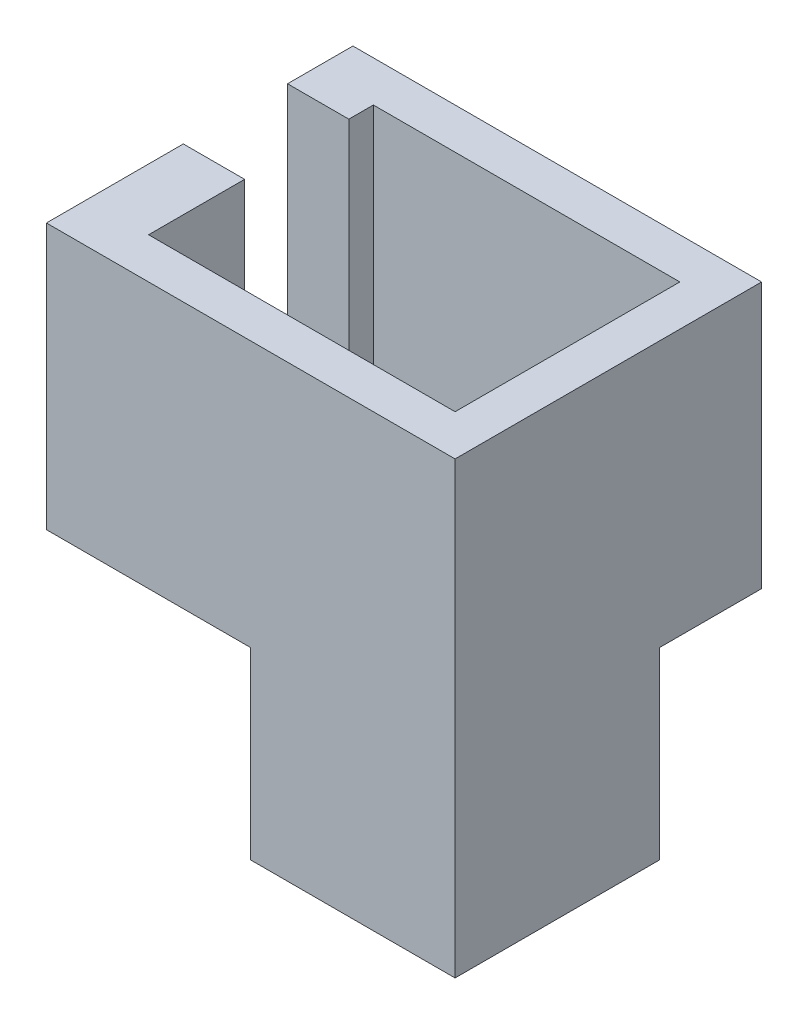
ISO-10303-21;
HEADER;
FILE_DESCRIPTION(('STEP AP214'),'2;1');
FILE_NAME('part.step','',(''),(''),'','','');
FILE_SCHEMA(('AUTOMOTIVE_DESIGN { 1 0 10303 214 1 1 1 1 }'));
ENDSEC;
DATA;
#1=APPLICATION_CONTEXT('core data for automotive mechanical design processes');
#2=APPLICATION_PROTOCOL_DEFINITION('international standard','automotive_design',2000,#1);
#3=PRODUCT_CONTEXT('',#1,'mechanical');
#4=PRODUCT('Part','Part','',(#3));
#5=PRODUCT_RELATED_PRODUCT_CATEGORY('part','',(#4));
#6=PRODUCT_DEFINITION_FORMATION('','',#4);
#7=PRODUCT_DEFINITION_CONTEXT('part definition',#1,'design');
#8=PRODUCT_DEFINITION('design','',#6,#7);
#9=PRODUCT_DEFINITION_SHAPE('','',#8);
#10=(LENGTH_UNIT() NAMED_UNIT(*) SI_UNIT(.MILLI.,.METRE.));
#11=(NAMED_UNIT(*) PLANE_ANGLE_UNIT() SI_UNIT($,.RADIAN.));
#12=(NAMED_UNIT(*) SI_UNIT($,.STERADIAN.) SOLID_ANGLE_UNIT());
#13=UNCERTAINTY_MEASURE_WITH_UNIT(LENGTH_MEASURE(1.E-05),#10,'distance_accuracy_value','');
#14=(GEOMETRIC_REPRESENTATION_CONTEXT(3) GLOBAL_UNCERTAINTY_ASSIGNED_CONTEXT((#13)) GLOBAL_UNIT_ASSIGNED_CONTEXT((#10,
#11,#12)) REPRESENTATION_CONTEXT('',''));
#15=CARTESIAN_POINT('',(0.,0.,0.));
#16=DIRECTION('',(0.,0.,1.));
#17=DIRECTION('',(1.,0.,0.));
#18=AXIS2_PLACEMENT_3D('',#15,#16,#17);
#19=CARTESIAN_POINT('',(0.,-1.,0.));
#20=DIRECTION('',(0.,1.,0.));
#21=DIRECTION('',(0.,0.,1.));
#22=AXIS2_PLACEMENT_3D('',#19,#20,#21);
#23=PLANE('',#22);
#24=DIRECTION('',(1.,0.,0.));
#25=VECTOR('',#24,1.);
#26=CARTESIAN_POINT('',(20.,-1.,-10.));
#27=LINE('',#26,#25);
#28=CARTESIAN_POINT('',(10.,-1.,-10.));
#29=VERTEX_POINT('',#28);
#30=CARTESIAN_POINT('',(20.,-1.,-10.));
#31=VERTEX_POINT('',#30);
#32=EDGE_CURVE('E165',#29,#31,#27,.T.);
#33=ORIENTED_EDGE('',*,*,#32,.F.);
#34=DIRECTION('',(0.,0.,-1.));
#35=VECTOR('',#34,1.);
#36=CARTESIAN_POINT('',(10.,-1.,0.));
#37=LINE('',#36,#35);
#38=CARTESIAN_POINT('',(10.,-1.,0.));
#39=VERTEX_POINT('',#38);
#40=EDGE_CURVE('E48',#39,#29,#37,.T.);
#41=ORIENTED_EDGE('',*,*,#40,.F.);
#42=DIRECTION('',(-1.,0.,0.));
#43=VECTOR('',#42,1.);
#44=CARTESIAN_POINT('',(20.,-1.,0.));
#45=LINE('',#44,#43);
#46=CARTESIAN_POINT('',(0.,-1.,0.));
#47=VERTEX_POINT('',#46);
#48=EDGE_CURVE('E182',#39,#47,#45,.T.);
#49=ORIENTED_EDGE('',*,*,#48,.T.);
#50=DIRECTION('',(0.,0.,-1.));
#51=VECTOR('',#50,1.);
#52=CARTESIAN_POINT('',(0.,-1.,0.));
#53=LINE('',#52,#51);
#54=CARTESIAN_POINT('',(0.,-1.,-15.));
#55=VERTEX_POINT('',#54);
#56=EDGE_CURVE('E184',#47,#55,#53,.T.);
#57=ORIENTED_EDGE('',*,*,#56,.T.);
#58=DIRECTION('',(1.,0.,0.));
#59=VECTOR('',#58,1.);
#60=CARTESIAN_POINT('',(20.,-1.,-15.));
#61=LINE('',#60,#59);
#62=CARTESIAN_POINT('',(20.,-1.,-15.));
#63=VERTEX_POINT('',#62);
#64=EDGE_CURVE('E187',#55,#63,#61,.T.);
#65=ORIENTED_EDGE('',*,*,#64,.T.);
#66=DIRECTION('',(0.,0.,1.));
#67=VECTOR('',#66,1.);
#68=CARTESIAN_POINT('',(20.,-1.,0.));
#69=LINE('',#68,#67);
#70=EDGE_CURVE('E54',#63,#31,#69,.T.);
#71=ORIENTED_EDGE('',*,*,#70,.T.);
#72=EDGE_LOOP('',(#33,#41,#49,#57,#65,#71));
#73=FACE_BOUND('',#72,.T.);
#74=ADVANCED_FACE('F33',(#73),#23,.F.);
#75=CARTESIAN_POINT('',(0.,12.,0.));
#76=DIRECTION('',(0.,0.,-1.));
#77=DIRECTION('',(-1.,0.,0.));
#78=AXIS2_PLACEMENT_3D('',#75,#76,#77);
#79=PLANE('',#78);
#80=DIRECTION('',(0.,-1.,0.));
#81=VECTOR('',#80,1.);
#82=CARTESIAN_POINT('',(0.,12.,0.));
#83=LINE('',#82,#81);
#84=CARTESIAN_POINT('',(0.,12.,0.));
#85=VERTEX_POINT('',#84);
#86=EDGE_CURVE('E41',#85,#47,#83,.T.);
#87=ORIENTED_EDGE('',*,*,#86,.T.);
#88=ORIENTED_EDGE('',*,*,#48,.F.);
#89=DIRECTION('',(0.,1.,0.));
#90=VECTOR('',#89,1.);
#91=CARTESIAN_POINT('',(10.,-10.,0.));
#92=LINE('',#91,#90);
#93=CARTESIAN_POINT('',(10.,-10.,0.));
#94=VERTEX_POINT('',#93);
#95=EDGE_CURVE('E156',#94,#39,#92,.T.);
#96=ORIENTED_EDGE('',*,*,#95,.F.);
#97=DIRECTION('',(-1.,0.,0.));
#98=VECTOR('',#97,1.);
#99=CARTESIAN_POINT('',(20.,-10.,0.));
#100=LINE('',#99,#98);
#101=CARTESIAN_POINT('',(20.,-10.,0.));
#102=VERTEX_POINT('',#101);
#103=EDGE_CURVE('E153',#102,#94,#100,.T.);
#104=ORIENTED_EDGE('',*,*,#103,.F.);
#105=DIRECTION('',(0.,-1.,0.));
#106=VECTOR('',#105,1.);
#107=CARTESIAN_POINT('',(20.,12.,0.));
#108=LINE('',#107,#106);
#109=CARTESIAN_POINT('',(20.,12.,0.));
#110=VERTEX_POINT('',#109);
#111=EDGE_CURVE('E141',#110,#102,#108,.T.);
#112=ORIENTED_EDGE('',*,*,#111,.F.);
#113=DIRECTION('',(1.,0.,0.));
#114=VECTOR('',#113,1.);
#115=CARTESIAN_POINT('',(0.,12.,0.));
#116=LINE('',#115,#114);
#117=EDGE_CURVE('E195',#85,#110,#116,.T.);
#118=ORIENTED_EDGE('',*,*,#117,.F.);
#119=EDGE_LOOP('',(#87,#88,#96,#104,#112,#118));
#120=FACE_BOUND('',#119,.T.);
#121=ADVANCED_FACE('F35',(#120),#79,.F.);
#122=CARTESIAN_POINT('',(20.,12.,0.));
#123=DIRECTION('',(-1.,0.,0.));
#124=DIRECTION('',(0.,0.,1.));
#125=AXIS2_PLACEMENT_3D('',#122,#123,#124);
#126=PLANE('',#125);
#127=ORIENTED_EDGE('',*,*,#111,.T.);
#128=DIRECTION('',(0.,0.,1.));
#129=VECTOR('',#128,1.);
#130=CARTESIAN_POINT('',(20.,-10.,0.));
#131=LINE('',#130,#129);
#132=CARTESIAN_POINT('',(20.,-10.,-10.));
#133=VERTEX_POINT('',#132);
#134=EDGE_CURVE('E146',#133,#102,#131,.T.);
#135=ORIENTED_EDGE('',*,*,#134,.F.);
#136=DIRECTION('',(0.,1.,0.));
#137=VECTOR('',#136,1.);
#138=CARTESIAN_POINT('',(20.,-10.,-10.));
#139=LINE('',#138,#137);
#140=EDGE_CURVE('E173',#133,#31,#139,.T.);
#141=ORIENTED_EDGE('',*,*,#140,.T.);
#142=ORIENTED_EDGE('',*,*,#70,.F.);
#143=DIRECTION('',(0.,-1.,0.));
#144=VECTOR('',#143,1.);
#145=CARTESIAN_POINT('',(20.,12.,-15.));
#146=LINE('',#145,#144);
#147=CARTESIAN_POINT('',(20.,12.,-15.));
#148=VERTEX_POINT('',#147);
#149=EDGE_CURVE('E150',#148,#63,#146,.T.);
#150=ORIENTED_EDGE('',*,*,#149,.F.);
#151=DIRECTION('',(0.,0.,-1.));
#152=VECTOR('',#151,1.);
#153=CARTESIAN_POINT('',(20.,12.,0.));
#154=LINE('',#153,#152);
#155=EDGE_CURVE('E148',#110,#148,#154,.T.);
#156=ORIENTED_EDGE('',*,*,#155,.F.);
#157=EDGE_LOOP('',(#127,#135,#141,#142,#150,#156));
#158=FACE_BOUND('',#157,.T.);
#159=ADVANCED_FACE('F143',(#158),#126,.F.);
#160=CARTESIAN_POINT('',(0.,12.,-15.));
#161=DIRECTION('',(0.,0.,1.));
#162=DIRECTION('',(1.,0.,0.));
#163=AXIS2_PLACEMENT_3D('',#160,#161,#162);
#164=PLANE('',#163);
#165=ORIENTED_EDGE('',*,*,#149,.T.);
#166=ORIENTED_EDGE('',*,*,#64,.F.);
#167=DIRECTION('',(0.,-1.,0.));
#168=VECTOR('',#167,1.);
#169=CARTESIAN_POINT('',(0.,12.,-15.));
#170=LINE('',#169,#168);
#171=CARTESIAN_POINT('',(0.,12.,-15.));
#172=VERTEX_POINT('',#171);
#173=EDGE_CURVE('E260',#172,#55,#170,.T.);
#174=ORIENTED_EDGE('',*,*,#173,.F.);
#175=DIRECTION('',(-1.,0.,0.));
#176=VECTOR('',#175,1.);
#177=CARTESIAN_POINT('',(0.,12.,-15.));
#178=LINE('',#177,#176);
#179=EDGE_CURVE('E199',#148,#172,#178,.T.);
#180=ORIENTED_EDGE('',*,*,#179,.F.);
#181=EDGE_LOOP('',(#165,#166,#174,#180));
#182=FACE_BOUND('',#181,.T.);
#183=ADVANCED_FACE('F271',(#182),#164,.F.);
#184=CARTESIAN_POINT('',(0.,12.,-15.));
#185=DIRECTION('',(1.,0.,0.));
#186=DIRECTION('',(0.,0.,-1.));
#187=AXIS2_PLACEMENT_3D('',#184,#185,#186);
#188=PLANE('',#187);
#189=ORIENTED_EDGE('',*,*,#173,.T.);
#190=ORIENTED_EDGE('',*,*,#56,.F.);
#191=ORIENTED_EDGE('',*,*,#86,.F.);
#192=DIRECTION('',(0.,0.,1.));
#193=VECTOR('',#192,1.);
#194=CARTESIAN_POINT('',(0.,12.,0.));
#195=LINE('',#194,#193);
#196=CARTESIAN_POINT('',(0.,12.,-6.7));
#197=VERTEX_POINT('',#196);
#198=EDGE_CURVE('E192',#197,#85,#195,.T.);
#199=ORIENTED_EDGE('',*,*,#198,.F.);
#200=DIRECTION('',(0.,-1.,0.));
#201=VECTOR('',#200,1.);
#202=CARTESIAN_POINT('',(0.,12.,-6.7));
#203=LINE('',#202,#201);
#204=CARTESIAN_POINT('',(0.,0.,-6.7));
#205=VERTEX_POINT('',#204);
#206=EDGE_CURVE('E217',#197,#205,#203,.T.);
#207=ORIENTED_EDGE('',*,*,#206,.T.);
#208=DIRECTION('',(0.,0.,-1.));
#209=VECTOR('',#208,1.);
#210=CARTESIAN_POINT('',(0.,0.,0.));
#211=LINE('',#210,#209);
#212=CARTESIAN_POINT('',(0.,0.,-11.8));
#213=VERTEX_POINT('',#212);
#214=EDGE_CURVE('E180',#205,#213,#211,.T.);
#215=ORIENTED_EDGE('',*,*,#214,.T.);
#216=DIRECTION('',(0.,-1.,0.));
#217=VECTOR('',#216,1.);
#218=CARTESIAN_POINT('',(0.,12.,-11.8));
#219=LINE('',#218,#217);
#220=CARTESIAN_POINT('',(0.,12.,-11.8));
#221=VERTEX_POINT('',#220);
#222=EDGE_CURVE('E257',#221,#213,#219,.T.);
#223=ORIENTED_EDGE('',*,*,#222,.F.);
#224=DIRECTION('',(0.,0.,1.));
#225=VECTOR('',#224,1.);
#226=CARTESIAN_POINT('',(0.,12.,-15.));
#227=LINE('',#226,#225);
#228=EDGE_CURVE('E201',#172,#221,#227,.T.);
#229=ORIENTED_EDGE('',*,*,#228,.F.);
#230=EDGE_LOOP('',(#189,#190,#191,#199,#207,#215,#223,#229));
#231=FACE_BOUND('',#230,.T.);
#232=ADVANCED_FACE('F266',(#231),#188,.F.);
#233=CARTESIAN_POINT('',(0.,12.,-11.8));
#234=DIRECTION('',(0.,0.,-1.));
#235=DIRECTION('',(-1.,0.,0.));
#236=AXIS2_PLACEMENT_3D('',#233,#234,#235);
#237=PLANE('',#236);
#238=DIRECTION('',(1.,0.,0.));
#239=VECTOR('',#238,1.);
#240=CARTESIAN_POINT('',(0.,0.,-11.8));
#241=LINE('',#240,#239);
#242=CARTESIAN_POINT('',(3.,0.,-11.8));
#243=VERTEX_POINT('',#242);
#244=EDGE_CURVE('E189',#213,#243,#241,.T.);
#245=ORIENTED_EDGE('',*,*,#244,.T.);
#246=DIRECTION('',(0.,-1.,0.));
#247=VECTOR('',#246,1.);
#248=CARTESIAN_POINT('',(3.,12.,-11.8));
#249=LINE('',#248,#247);
#250=CARTESIAN_POINT('',(3.,12.,-11.8));
#251=VERTEX_POINT('',#250);
#252=EDGE_CURVE('E254',#251,#243,#249,.T.);
#253=ORIENTED_EDGE('',*,*,#252,.F.);
#254=DIRECTION('',(1.,0.,0.));
#255=VECTOR('',#254,1.);
#256=CARTESIAN_POINT('',(0.,12.,-11.8));
#257=LINE('',#256,#255);
#258=EDGE_CURVE('E203',#221,#251,#257,.T.);
#259=ORIENTED_EDGE('',*,*,#258,.F.);
#260=ORIENTED_EDGE('',*,*,#222,.T.);
#261=EDGE_LOOP('',(#245,#253,#259,#260));
#262=FACE_BOUND('',#261,.T.);
#263=ADVANCED_FACE('F324',(#262),#237,.F.);
#264=CARTESIAN_POINT('',(3.,12.,-11.8));
#265=DIRECTION('',(-1.,0.,0.));
#266=DIRECTION('',(0.,0.,1.));
#267=AXIS2_PLACEMENT_3D('',#264,#265,#266);
#268=PLANE('',#267);
#269=DIRECTION('',(0.,0.,-1.));
#270=VECTOR('',#269,1.);
#271=CARTESIAN_POINT('',(3.,0.,-11.8));
#272=LINE('',#271,#270);
#273=CARTESIAN_POINT('',(3.,0.,-13.));
#274=VERTEX_POINT('',#273);
#275=EDGE_CURVE('E220',#243,#274,#272,.T.);
#276=ORIENTED_EDGE('',*,*,#275,.T.);
#277=DIRECTION('',(0.,-1.,0.));
#278=VECTOR('',#277,1.);
#279=CARTESIAN_POINT('',(3.,12.,-13.));
#280=LINE('',#279,#278);
#281=CARTESIAN_POINT('',(3.,12.,-13.));
#282=VERTEX_POINT('',#281);
#283=EDGE_CURVE('E251',#282,#274,#280,.T.);
#284=ORIENTED_EDGE('',*,*,#283,.F.);
#285=DIRECTION('',(0.,0.,-1.));
#286=VECTOR('',#285,1.);
#287=CARTESIAN_POINT('',(3.,12.,-11.8));
#288=LINE('',#287,#286);
#289=EDGE_CURVE('E205',#251,#282,#288,.T.);
#290=ORIENTED_EDGE('',*,*,#289,.F.);
#291=ORIENTED_EDGE('',*,*,#252,.T.);
#292=EDGE_LOOP('',(#276,#284,#290,#291));
#293=FACE_BOUND('',#292,.T.);
#294=ADVANCED_FACE('F320',(#293),#268,.F.);
#295=CARTESIAN_POINT('',(18.,12.,-13.));
#296=DIRECTION('',(0.,0.,-1.));
#297=DIRECTION('',(-1.,0.,0.));
#298=AXIS2_PLACEMENT_3D('',#295,#296,#297);
#299=PLANE('',#298);
#300=DIRECTION('',(1.,0.,0.));
#301=VECTOR('',#300,1.);
#302=CARTESIAN_POINT('',(18.,0.,-13.));
#303=LINE('',#302,#301);
#304=CARTESIAN_POINT('',(18.,0.,-13.));
#305=VERTEX_POINT('',#304);
#306=EDGE_CURVE('E223',#274,#305,#303,.T.);
#307=ORIENTED_EDGE('',*,*,#306,.T.);
#308=DIRECTION('',(0.,-1.,0.));
#309=VECTOR('',#308,1.);
#310=CARTESIAN_POINT('',(18.,12.,-13.));
#311=LINE('',#310,#309);
#312=CARTESIAN_POINT('',(18.,12.,-13.));
#313=VERTEX_POINT('',#312);
#314=EDGE_CURVE('E248',#313,#305,#311,.T.);
#315=ORIENTED_EDGE('',*,*,#314,.F.);
#316=DIRECTION('',(1.,0.,0.));
#317=VECTOR('',#316,1.);
#318=CARTESIAN_POINT('',(18.,12.,-13.));
#319=LINE('',#318,#317);
#320=EDGE_CURVE('E207',#282,#313,#319,.T.);
#321=ORIENTED_EDGE('',*,*,#320,.F.);
#322=ORIENTED_EDGE('',*,*,#283,.T.);
#323=EDGE_LOOP('',(#307,#315,#321,#322));
#324=FACE_BOUND('',#323,.T.);
#325=ADVANCED_FACE('F316',(#324),#299,.F.);
#326=CARTESIAN_POINT('',(18.,12.,-2.));
#327=DIRECTION('',(1.,0.,0.));
#328=DIRECTION('',(0.,0.,-1.));
#329=AXIS2_PLACEMENT_3D('',#326,#327,#328);
#330=PLANE('',#329);
#331=CARTESIAN_POINT('',(18.,2.51,-10.49));
#332=DIRECTION('',(1.,0.,0.));
#333=DIRECTION('',(0.,0.,-1.));
#334=AXIS2_PLACEMENT_3D('',#331,#332,#333);
#335=CIRCLE('',#334,2.5);
#336=CARTESIAN_POINT('',(18.,2.51,-12.99));
#337=VERTEX_POINT('',#336);
#338=EDGE_CURVE('E11',#337,#337,#335,.F.);
#339=ORIENTED_EDGE('',*,*,#338,.F.);
#340=EDGE_LOOP('',(#339));
#341=FACE_BOUND('',#340,.T.);
#342=DIRECTION('',(0.,0.,1.));
#343=VECTOR('',#342,1.);
#344=CARTESIAN_POINT('',(18.,0.,-2.));
#345=LINE('',#344,#343);
#346=CARTESIAN_POINT('',(18.,0.,-2.));
#347=VERTEX_POINT('',#346);
#348=EDGE_CURVE('E226',#305,#347,#345,.T.);
#349=ORIENTED_EDGE('',*,*,#348,.T.);
#350=DIRECTION('',(0.,-1.,0.));
#351=VECTOR('',#350,1.);
#352=CARTESIAN_POINT('',(18.,12.,-2.));
#353=LINE('',#352,#351);
#354=CARTESIAN_POINT('',(18.,12.,-2.));
#355=VERTEX_POINT('',#354);
#356=EDGE_CURVE('E245',#355,#347,#353,.T.);
#357=ORIENTED_EDGE('',*,*,#356,.F.);
#358=DIRECTION('',(0.,0.,1.));
#359=VECTOR('',#358,1.);
#360=CARTESIAN_POINT('',(18.,12.,-2.));
#361=LINE('',#360,#359);
#362=EDGE_CURVE('E209',#313,#355,#361,.T.);
#363=ORIENTED_EDGE('',*,*,#362,.F.);
#364=ORIENTED_EDGE('',*,*,#314,.T.);
#365=EDGE_LOOP('',(#349,#357,#363,#364));
#366=FACE_BOUND('',#365,.T.);
#367=ADVANCED_FACE('F312',(#341,#366),#330,.F.);
#368=CARTESIAN_POINT('',(3.,12.,-2.));
#369=DIRECTION('',(0.,0.,1.));
#370=DIRECTION('',(1.,0.,0.));
#371=AXIS2_PLACEMENT_3D('',#368,#369,#370);
#372=PLANE('',#371);
#373=DIRECTION('',(-1.,0.,0.));
#374=VECTOR('',#373,1.);
#375=CARTESIAN_POINT('',(3.,0.,-2.));
#376=LINE('',#375,#374);
#377=CARTESIAN_POINT('',(3.,0.,-2.));
#378=VERTEX_POINT('',#377);
#379=EDGE_CURVE('E229',#347,#378,#376,.T.);
#380=ORIENTED_EDGE('',*,*,#379,.T.);
#381=DIRECTION('',(0.,-1.,0.));
#382=VECTOR('',#381,1.);
#383=CARTESIAN_POINT('',(3.,12.,-2.));
#384=LINE('',#383,#382);
#385=CARTESIAN_POINT('',(3.,12.,-2.));
#386=VERTEX_POINT('',#385);
#387=EDGE_CURVE('E242',#386,#378,#384,.T.);
#388=ORIENTED_EDGE('',*,*,#387,.F.);
#389=DIRECTION('',(-1.,0.,0.));
#390=VECTOR('',#389,1.);
#391=CARTESIAN_POINT('',(3.,12.,-2.));
#392=LINE('',#391,#390);
#393=EDGE_CURVE('E211',#355,#386,#392,.T.);
#394=ORIENTED_EDGE('',*,*,#393,.F.);
#395=ORIENTED_EDGE('',*,*,#356,.T.);
#396=EDGE_LOOP('',(#380,#388,#394,#395));
#397=FACE_BOUND('',#396,.T.);
#398=ADVANCED_FACE('F308',(#397),#372,.F.);
#399=CARTESIAN_POINT('',(3.,12.,-2.));
#400=DIRECTION('',(-1.,0.,0.));
#401=DIRECTION('',(0.,0.,1.));
#402=AXIS2_PLACEMENT_3D('',#399,#400,#401);
#403=PLANE('',#402);
#404=DIRECTION('',(0.,0.,-1.));
#405=VECTOR('',#404,1.);
#406=CARTESIAN_POINT('',(3.,0.,-2.));
#407=LINE('',#406,#405);
#408=CARTESIAN_POINT('',(3.,0.,-6.7));
#409=VERTEX_POINT('',#408);
#410=EDGE_CURVE('E232',#378,#409,#407,.T.);
#411=ORIENTED_EDGE('',*,*,#410,.T.);
#412=DIRECTION('',(0.,-1.,0.));
#413=VECTOR('',#412,1.);
#414=CARTESIAN_POINT('',(3.,12.,-6.7));
#415=LINE('',#414,#413);
#416=CARTESIAN_POINT('',(3.,12.,-6.7));
#417=VERTEX_POINT('',#416);
#418=EDGE_CURVE('E239',#417,#409,#415,.T.);
#419=ORIENTED_EDGE('',*,*,#418,.F.);
#420=DIRECTION('',(0.,0.,-1.));
#421=VECTOR('',#420,1.);
#422=CARTESIAN_POINT('',(3.,12.,-2.));
#423=LINE('',#422,#421);
#424=EDGE_CURVE('E213',#386,#417,#423,.T.);
#425=ORIENTED_EDGE('',*,*,#424,.F.);
#426=ORIENTED_EDGE('',*,*,#387,.T.);
#427=EDGE_LOOP('',(#411,#419,#425,#426));
#428=FACE_BOUND('',#427,.T.);
#429=ADVANCED_FACE('F304',(#428),#403,.F.);
#430=CARTESIAN_POINT('',(0.,12.,-6.7));
#431=DIRECTION('',(0.,0.,1.));
#432=DIRECTION('',(1.,0.,0.));
#433=AXIS2_PLACEMENT_3D('',#430,#431,#432);
#434=PLANE('',#433);
#435=DIRECTION('',(-1.,0.,0.));
#436=VECTOR('',#435,1.);
#437=CARTESIAN_POINT('',(0.,0.,-6.7));
#438=LINE('',#437,#436);
#439=EDGE_CURVE('E196',#409,#205,#438,.T.);
#440=ORIENTED_EDGE('',*,*,#439,.T.);
#441=ORIENTED_EDGE('',*,*,#206,.F.);
#442=DIRECTION('',(-1.,0.,0.));
#443=VECTOR('',#442,1.);
#444=CARTESIAN_POINT('',(0.,12.,-6.7));
#445=LINE('',#444,#443);
#446=EDGE_CURVE('E215',#417,#197,#445,.T.);
#447=ORIENTED_EDGE('',*,*,#446,.F.);
#448=ORIENTED_EDGE('',*,*,#418,.T.);
#449=EDGE_LOOP('',(#440,#441,#447,#448));
#450=FACE_BOUND('',#449,.T.);
#451=ADVANCED_FACE('F300',(#450),#434,.F.);
#452=CARTESIAN_POINT('',(0.,12.,0.));
#453=DIRECTION('',(0.,-1.,0.));
#454=DIRECTION('',(0.,0.,-1.));
#455=AXIS2_PLACEMENT_3D('',#452,#453,#454);
#456=PLANE('',#455);
#457=ORIENTED_EDGE('',*,*,#198,.T.);
#458=ORIENTED_EDGE('',*,*,#117,.T.);
#459=ORIENTED_EDGE('',*,*,#155,.T.);
#460=ORIENTED_EDGE('',*,*,#179,.T.);
#461=ORIENTED_EDGE('',*,*,#228,.T.);
#462=ORIENTED_EDGE('',*,*,#258,.T.);
#463=ORIENTED_EDGE('',*,*,#289,.T.);
#464=ORIENTED_EDGE('',*,*,#320,.T.);
#465=ORIENTED_EDGE('',*,*,#362,.T.);
#466=ORIENTED_EDGE('',*,*,#393,.T.);
#467=ORIENTED_EDGE('',*,*,#424,.T.);
#468=ORIENTED_EDGE('',*,*,#446,.T.);
#469=EDGE_LOOP('',(#457,#458,#459,#460,#461,#462,#463,#464,#465,#466,#467,#468));
#470=FACE_BOUND('',#469,.T.);
#471=ADVANCED_FACE('F287',(#470),#456,.F.);
#472=CARTESIAN_POINT('',(0.,0.,0.));
#473=DIRECTION('',(0.,1.,0.));
#474=DIRECTION('',(0.,0.,1.));
#475=AXIS2_PLACEMENT_3D('',#472,#473,#474);
#476=PLANE('',#475);
#477=ORIENTED_EDGE('',*,*,#439,.F.);
#478=ORIENTED_EDGE('',*,*,#410,.F.);
#479=ORIENTED_EDGE('',*,*,#379,.F.);
#480=ORIENTED_EDGE('',*,*,#348,.F.);
#481=ORIENTED_EDGE('',*,*,#306,.F.);
#482=ORIENTED_EDGE('',*,*,#275,.F.);
#483=ORIENTED_EDGE('',*,*,#244,.F.);
#484=ORIENTED_EDGE('',*,*,#214,.F.);
#485=EDGE_LOOP('',(#477,#478,#479,#480,#481,#482,#483,#484));
#486=FACE_BOUND('',#485,.T.);
#487=ADVANCED_FACE('F279',(#486),#476,.T.);
#488=CARTESIAN_POINT('',(10.,-10.,0.));
#489=DIRECTION('',(1.,0.,0.));
#490=DIRECTION('',(0.,0.,-1.));
#491=AXIS2_PLACEMENT_3D('',#488,#489,#490);
#492=PLANE('',#491);
#493=ORIENTED_EDGE('',*,*,#40,.T.);
#494=DIRECTION('',(0.,1.,0.));
#495=VECTOR('',#494,1.);
#496=CARTESIAN_POINT('',(10.,-10.,-10.));
#497=LINE('',#496,#495);
#498=CARTESIAN_POINT('',(10.,-10.,-10.));
#499=VERTEX_POINT('',#498);
#500=EDGE_CURVE('E176',#499,#29,#497,.T.);
#501=ORIENTED_EDGE('',*,*,#500,.F.);
#502=DIRECTION('',(0.,0.,-1.));
#503=VECTOR('',#502,1.);
#504=CARTESIAN_POINT('',(10.,-10.,0.));
#505=LINE('',#504,#503);
#506=EDGE_CURVE('E159',#94,#499,#505,.T.);
#507=ORIENTED_EDGE('',*,*,#506,.F.);
#508=ORIENTED_EDGE('',*,*,#95,.T.);
#509=EDGE_LOOP('',(#493,#501,#507,#508));
#510=FACE_BOUND('',#509,.T.);
#511=ADVANCED_FACE('F277',(#510),#492,.F.);
#512=CARTESIAN_POINT('',(20.,-10.,-10.));
#513=DIRECTION('',(0.,0.,1.));
#514=DIRECTION('',(1.,0.,0.));
#515=AXIS2_PLACEMENT_3D('',#512,#513,#514);
#516=PLANE('',#515);
#517=ORIENTED_EDGE('',*,*,#32,.T.);
#518=ORIENTED_EDGE('',*,*,#140,.F.);
#519=DIRECTION('',(1.,0.,0.));
#520=VECTOR('',#519,1.);
#521=CARTESIAN_POINT('',(20.,-10.,-10.));
#522=LINE('',#521,#520);
#523=EDGE_CURVE('E163',#499,#133,#522,.T.);
#524=ORIENTED_EDGE('',*,*,#523,.F.);
#525=ORIENTED_EDGE('',*,*,#500,.T.);
#526=EDGE_LOOP('',(#517,#518,#524,#525));
#527=FACE_BOUND('',#526,.T.);
#528=ADVANCED_FACE('F274',(#527),#516,.F.);
#529=CARTESIAN_POINT('',(0.,-10.,0.));
#530=DIRECTION('',(0.,1.,0.));
#531=DIRECTION('',(0.,0.,1.));
#532=AXIS2_PLACEMENT_3D('',#529,#530,#531);
#533=PLANE('',#532);
#534=ORIENTED_EDGE('',*,*,#134,.T.);
#535=ORIENTED_EDGE('',*,*,#103,.T.);
#536=ORIENTED_EDGE('',*,*,#506,.T.);
#537=ORIENTED_EDGE('',*,*,#523,.T.);
#538=EDGE_LOOP('',(#534,#535,#536,#537));
#539=FACE_BOUND('',#538,.T.);
#540=ADVANCED_FACE('F161',(#539),#533,.F.);
#541=CARTESIAN_POINT('',(17.9,2.51,-10.49));
#542=DIRECTION('',(1.,0.,0.));
#543=DIRECTION('',(0.,0.,-1.));
#544=AXIS2_PLACEMENT_3D('',#541,#542,#543);
#545=CYLINDRICAL_SURFACE('',#544,2.5);
#546=CARTESIAN_POINT('',(17.9,2.51,-10.49));
#547=DIRECTION('',(-1.,0.,0.));
#548=DIRECTION('',(0.,0.,1.));
#549=AXIS2_PLACEMENT_3D('',#546,#547,#548);
#550=CIRCLE('',#549,2.5);
#551=CARTESIAN_POINT('',(17.9,2.51,-7.99));
#552=VERTEX_POINT('',#551);
#553=EDGE_CURVE('E169',#552,#552,#550,.T.);
#554=ORIENTED_EDGE('',*,*,#553,.F.);
#555=EDGE_LOOP('',(#554));
#556=FACE_BOUND('',#555,.T.);
#557=ORIENTED_EDGE('',*,*,#338,.T.);
#558=EDGE_LOOP('',(#557));
#559=FACE_BOUND('',#558,.T.);
#560=ADVANCED_FACE('F435',(#556,#559),#545,.T.);
#561=CARTESIAN_POINT('',(17.9,2.51,-10.49));
#562=DIRECTION('',(-1.,0.,0.));
#563=DIRECTION('',(0.,0.,1.));
#564=AXIS2_PLACEMENT_3D('',#561,#562,#563);
#565=PLANE('',#564);
#566=ORIENTED_EDGE('',*,*,#553,.T.);
#567=EDGE_LOOP('',(#566));
#568=FACE_BOUND('',#567,.T.);
#569=ADVANCED_FACE('F442',(#568),#565,.T.);
#570=CLOSED_SHELL('',(#74,#121,#159,#183,#232,#263,#294,#325,#367,#398,#429,#451,#471,#487,#511,
#528,#540,#560,#569));
#571=MANIFOLD_SOLID_BREP('B2',#570);
#572=ADVANCED_BREP_SHAPE_REPRESENTATION('',(#18,#571),#14);
#573=SHAPE_DEFINITION_REPRESENTATION(#9,#572);
ENDSEC;
END-ISO-10303-21;
